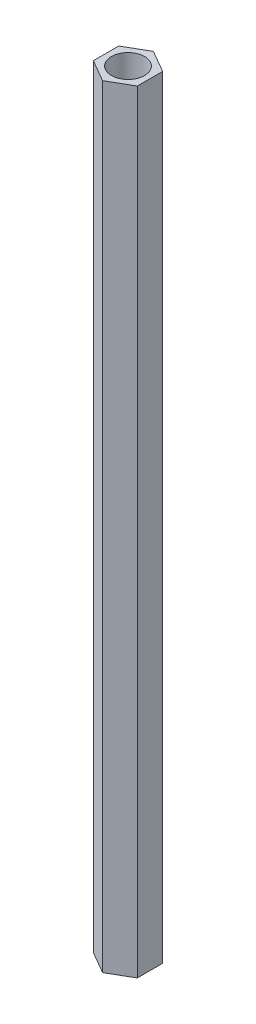
ISO-10303-21;
HEADER;
FILE_DESCRIPTION(('STEP AP214'),'2;1');
FILE_NAME('part.step','',(''),(''),'','','');
FILE_SCHEMA(('AUTOMOTIVE_DESIGN { 1 0 10303 214 1 1 1 1 }'));
ENDSEC;
DATA;
#1=APPLICATION_CONTEXT('core data for automotive mechanical design processes');
#2=APPLICATION_PROTOCOL_DEFINITION('international standard','automotive_design',2000,#1);
#3=PRODUCT_CONTEXT('',#1,'mechanical');
#4=PRODUCT('Part','Part','',(#3));
#5=PRODUCT_RELATED_PRODUCT_CATEGORY('part','',(#4));
#6=PRODUCT_DEFINITION_FORMATION('','',#4);
#7=PRODUCT_DEFINITION_CONTEXT('part definition',#1,'design');
#8=PRODUCT_DEFINITION('design','',#6,#7);
#9=PRODUCT_DEFINITION_SHAPE('','',#8);
#10=(LENGTH_UNIT() NAMED_UNIT(*) SI_UNIT(.MILLI.,.METRE.));
#11=(NAMED_UNIT(*) PLANE_ANGLE_UNIT() SI_UNIT($,.RADIAN.));
#12=(NAMED_UNIT(*) SI_UNIT($,.STERADIAN.) SOLID_ANGLE_UNIT());
#13=UNCERTAINTY_MEASURE_WITH_UNIT(LENGTH_MEASURE(1.E-05),#10,'distance_accuracy_value','');
#14=(GEOMETRIC_REPRESENTATION_CONTEXT(3) GLOBAL_UNCERTAINTY_ASSIGNED_CONTEXT((#13)) GLOBAL_UNIT_ASSIGNED_CONTEXT((#10,
#11,#12)) REPRESENTATION_CONTEXT('',''));
#15=CARTESIAN_POINT('',(0.,0.,0.));
#16=DIRECTION('',(0.,0.,1.));
#17=DIRECTION('',(1.,0.,0.));
#18=AXIS2_PLACEMENT_3D('',#15,#16,#17);
#19=CARTESIAN_POINT('',(0.,70.,0.));
#20=DIRECTION('',(0.,1.,0.));
#21=DIRECTION('',(0.,0.,1.));
#22=AXIS2_PLACEMENT_3D('',#19,#20,#21);
#23=PLANE('',#22);
#24=DIRECTION('',(-0.866025403784439,0.,-0.5));
#25=VECTOR('',#24,1.);
#26=CARTESIAN_POINT('',(1.99185842870421,70.,-1.15));
#27=LINE('',#26,#25);
#28=CARTESIAN_POINT('',(1.99185842870421,70.,-1.15));
#29=VERTEX_POINT('',#28);
#30=CARTESIAN_POINT('',(0.,70.,-2.3));
#31=VERTEX_POINT('',#30);
#32=EDGE_CURVE('E137',#29,#31,#27,.T.);
#33=ORIENTED_EDGE('',*,*,#32,.T.);
#34=DIRECTION('',(-0.866025403784439,0.,0.5));
#35=VECTOR('',#34,1.);
#36=CARTESIAN_POINT('',(0.,70.,-2.3));
#37=LINE('',#36,#35);
#38=CARTESIAN_POINT('',(-1.99185842870421,70.,-1.15));
#39=VERTEX_POINT('',#38);
#40=EDGE_CURVE('E95',#31,#39,#37,.T.);
#41=ORIENTED_EDGE('',*,*,#40,.T.);
#42=DIRECTION('',(0.,0.,1.));
#43=VECTOR('',#42,1.);
#44=CARTESIAN_POINT('',(-1.99185842870421,70.,-1.15));
#45=LINE('',#44,#43);
#46=CARTESIAN_POINT('',(-1.99185842870421,70.,1.15));
#47=VERTEX_POINT('',#46);
#48=EDGE_CURVE('E108',#39,#47,#45,.T.);
#49=ORIENTED_EDGE('',*,*,#48,.T.);
#50=DIRECTION('',(0.866025403784439,0.,0.5));
#51=VECTOR('',#50,1.);
#52=CARTESIAN_POINT('',(-1.99185842870421,70.,1.15));
#53=LINE('',#52,#51);
#54=CARTESIAN_POINT('',(0.,70.,2.3));
#55=VERTEX_POINT('',#54);
#56=EDGE_CURVE('E102',#47,#55,#53,.T.);
#57=ORIENTED_EDGE('',*,*,#56,.T.);
#58=DIRECTION('',(0.866025403784439,0.,-0.5));
#59=VECTOR('',#58,1.);
#60=CARTESIAN_POINT('',(0.,70.,2.3));
#61=LINE('',#60,#59);
#62=CARTESIAN_POINT('',(1.99185842870421,70.,1.15));
#63=VERTEX_POINT('',#62);
#64=EDGE_CURVE('E106',#55,#63,#61,.T.);
#65=ORIENTED_EDGE('',*,*,#64,.T.);
#66=DIRECTION('',(0.,0.,-1.));
#67=VECTOR('',#66,1.);
#68=CARTESIAN_POINT('',(1.99185842870421,70.,1.15));
#69=LINE('',#68,#67);
#70=EDGE_CURVE('E58',#63,#29,#69,.T.);
#71=ORIENTED_EDGE('',*,*,#70,.T.);
#72=EDGE_LOOP('',(#33,#41,#49,#57,#65,#71));
#73=FACE_BOUND('',#72,.T.);
#74=CARTESIAN_POINT('',(0.,70.,0.));
#75=DIRECTION('',(0.,1.,0.));
#76=DIRECTION('',(0.,0.,1.));
#77=AXIS2_PLACEMENT_3D('',#74,#75,#76);
#78=CIRCLE('',#77,1.5);
#79=CARTESIAN_POINT('',(0.,70.,1.5));
#80=VERTEX_POINT('',#79);
#81=EDGE_CURVE('E130',#80,#80,#78,.T.);
#82=ORIENTED_EDGE('',*,*,#81,.F.);
#83=EDGE_LOOP('',(#82));
#84=FACE_BOUND('',#83,.T.);
#85=ADVANCED_FACE('F41',(#73,#84),#23,.T.);
#86=CARTESIAN_POINT('',(0.,0.,0.));
#87=DIRECTION('',(0.,1.,0.));
#88=DIRECTION('',(0.,0.,1.));
#89=AXIS2_PLACEMENT_3D('',#86,#87,#88);
#90=PLANE('',#89);
#91=DIRECTION('',(-0.866025403784439,0.,-0.5));
#92=VECTOR('',#91,1.);
#93=CARTESIAN_POINT('',(1.99185842870421,0.,-1.15));
#94=LINE('',#93,#92);
#95=CARTESIAN_POINT('',(1.99185842870421,0.,-1.15));
#96=VERTEX_POINT('',#95);
#97=CARTESIAN_POINT('',(0.,0.,-2.3));
#98=VERTEX_POINT('',#97);
#99=EDGE_CURVE('E126',#96,#98,#94,.T.);
#100=ORIENTED_EDGE('',*,*,#99,.F.);
#101=DIRECTION('',(0.,0.,-1.));
#102=VECTOR('',#101,1.);
#103=CARTESIAN_POINT('',(1.99185842870421,0.,1.15));
#104=LINE('',#103,#102);
#105=CARTESIAN_POINT('',(1.99185842870421,0.,1.15));
#106=VERTEX_POINT('',#105);
#107=EDGE_CURVE('E87',#106,#96,#104,.T.);
#108=ORIENTED_EDGE('',*,*,#107,.F.);
#109=DIRECTION('',(0.866025403784439,0.,-0.5));
#110=VECTOR('',#109,1.);
#111=CARTESIAN_POINT('',(0.,0.,2.3));
#112=LINE('',#111,#110);
#113=CARTESIAN_POINT('',(0.,0.,2.3));
#114=VERTEX_POINT('',#113);
#115=EDGE_CURVE('E81',#114,#106,#112,.T.);
#116=ORIENTED_EDGE('',*,*,#115,.F.);
#117=DIRECTION('',(0.866025403784439,0.,0.5));
#118=VECTOR('',#117,1.);
#119=CARTESIAN_POINT('',(-1.99185842870421,0.,1.15));
#120=LINE('',#119,#118);
#121=CARTESIAN_POINT('',(-1.99185842870421,0.,1.15));
#122=VERTEX_POINT('',#121);
#123=EDGE_CURVE('E116',#122,#114,#120,.T.);
#124=ORIENTED_EDGE('',*,*,#123,.F.);
#125=DIRECTION('',(0.,0.,1.));
#126=VECTOR('',#125,1.);
#127=CARTESIAN_POINT('',(-1.99185842870421,0.,-1.15));
#128=LINE('',#127,#126);
#129=CARTESIAN_POINT('',(-1.99185842870421,0.,-1.15));
#130=VERTEX_POINT('',#129);
#131=EDGE_CURVE('E132',#130,#122,#128,.T.);
#132=ORIENTED_EDGE('',*,*,#131,.F.);
#133=DIRECTION('',(-0.866025403784439,0.,0.5));
#134=VECTOR('',#133,1.);
#135=CARTESIAN_POINT('',(0.,0.,-2.3));
#136=LINE('',#135,#134);
#137=EDGE_CURVE('E129',#98,#130,#136,.T.);
#138=ORIENTED_EDGE('',*,*,#137,.F.);
#139=EDGE_LOOP('',(#100,#108,#116,#124,#132,#138));
#140=FACE_BOUND('',#139,.T.);
#141=CARTESIAN_POINT('',(0.,0.,0.));
#142=DIRECTION('',(0.,1.,0.));
#143=DIRECTION('',(0.,0.,1.));
#144=AXIS2_PLACEMENT_3D('',#141,#142,#143);
#145=CIRCLE('',#144,1.5);
#146=CARTESIAN_POINT('',(0.,0.,1.5));
#147=VERTEX_POINT('',#146);
#148=EDGE_CURVE('E230',#147,#147,#145,.T.);
#149=ORIENTED_EDGE('',*,*,#148,.T.);
#150=EDGE_LOOP('',(#149));
#151=FACE_BOUND('',#150,.T.);
#152=ADVANCED_FACE('F146',(#140,#151),#90,.F.);
#153=CARTESIAN_POINT('',(1.99185842870421,70.,-1.15));
#154=DIRECTION('',(-0.5,0.,0.866025403784439));
#155=DIRECTION('',(0.866025403784439,0.,0.5));
#156=AXIS2_PLACEMENT_3D('',#153,#154,#155);
#157=PLANE('',#156);
#158=ORIENTED_EDGE('',*,*,#99,.T.);
#159=DIRECTION('',(0.,-1.,0.));
#160=VECTOR('',#159,1.);
#161=CARTESIAN_POINT('',(0.,70.,-2.3));
#162=LINE('',#161,#160);
#163=EDGE_CURVE('E11',#31,#98,#162,.T.);
#164=ORIENTED_EDGE('',*,*,#163,.F.);
#165=ORIENTED_EDGE('',*,*,#32,.F.);
#166=DIRECTION('',(0.,-1.,0.));
#167=VECTOR('',#166,1.);
#168=CARTESIAN_POINT('',(1.99185842870421,70.,-1.15));
#169=LINE('',#168,#167);
#170=EDGE_CURVE('E122',#29,#96,#169,.T.);
#171=ORIENTED_EDGE('',*,*,#170,.T.);
#172=EDGE_LOOP('',(#158,#164,#165,#171));
#173=FACE_BOUND('',#172,.T.);
#174=ADVANCED_FACE('F43',(#173),#157,.F.);
#175=CARTESIAN_POINT('',(0.,70.,-2.3));
#176=DIRECTION('',(0.5,0.,0.866025403784439));
#177=DIRECTION('',(0.866025403784439,0.,-0.5));
#178=AXIS2_PLACEMENT_3D('',#175,#176,#177);
#179=PLANE('',#178);
#180=ORIENTED_EDGE('',*,*,#137,.T.);
#181=DIRECTION('',(0.,-1.,0.));
#182=VECTOR('',#181,1.);
#183=CARTESIAN_POINT('',(-1.99185842870421,70.,-1.15));
#184=LINE('',#183,#182);
#185=EDGE_CURVE('E50',#39,#130,#184,.T.);
#186=ORIENTED_EDGE('',*,*,#185,.F.);
#187=ORIENTED_EDGE('',*,*,#40,.F.);
#188=ORIENTED_EDGE('',*,*,#163,.T.);
#189=EDGE_LOOP('',(#180,#186,#187,#188));
#190=FACE_BOUND('',#189,.T.);
#191=ADVANCED_FACE('F171',(#190),#179,.F.);
#192=CARTESIAN_POINT('',(-1.99185842870421,70.,-1.15));
#193=DIRECTION('',(1.,0.,0.));
#194=DIRECTION('',(0.,0.,-1.));
#195=AXIS2_PLACEMENT_3D('',#192,#193,#194);
#196=PLANE('',#195);
#197=ORIENTED_EDGE('',*,*,#131,.T.);
#198=DIRECTION('',(0.,-1.,0.));
#199=VECTOR('',#198,1.);
#200=CARTESIAN_POINT('',(-1.99185842870421,70.,1.15));
#201=LINE('',#200,#199);
#202=EDGE_CURVE('E117',#47,#122,#201,.T.);
#203=ORIENTED_EDGE('',*,*,#202,.F.);
#204=ORIENTED_EDGE('',*,*,#48,.F.);
#205=ORIENTED_EDGE('',*,*,#185,.T.);
#206=EDGE_LOOP('',(#197,#203,#204,#205));
#207=FACE_BOUND('',#206,.T.);
#208=ADVANCED_FACE('F143',(#207),#196,.F.);
#209=CARTESIAN_POINT('',(-1.99185842870421,70.,1.15));
#210=DIRECTION('',(0.5,0.,-0.866025403784439));
#211=DIRECTION('',(-0.866025403784439,0.,-0.5));
#212=AXIS2_PLACEMENT_3D('',#209,#210,#211);
#213=PLANE('',#212);
#214=ORIENTED_EDGE('',*,*,#123,.T.);
#215=DIRECTION('',(0.,-1.,0.));
#216=VECTOR('',#215,1.);
#217=CARTESIAN_POINT('',(0.,70.,2.3));
#218=LINE('',#217,#216);
#219=EDGE_CURVE('E113',#55,#114,#218,.T.);
#220=ORIENTED_EDGE('',*,*,#219,.F.);
#221=ORIENTED_EDGE('',*,*,#56,.F.);
#222=ORIENTED_EDGE('',*,*,#202,.T.);
#223=EDGE_LOOP('',(#214,#220,#221,#222));
#224=FACE_BOUND('',#223,.T.);
#225=ADVANCED_FACE('F114',(#224),#213,.F.);
#226=CARTESIAN_POINT('',(0.,70.,2.3));
#227=DIRECTION('',(-0.5,0.,-0.866025403784439));
#228=DIRECTION('',(-0.866025403784439,0.,0.5));
#229=AXIS2_PLACEMENT_3D('',#226,#227,#228);
#230=PLANE('',#229);
#231=ORIENTED_EDGE('',*,*,#115,.T.);
#232=DIRECTION('',(0.,-1.,0.));
#233=VECTOR('',#232,1.);
#234=CARTESIAN_POINT('',(1.99185842870421,70.,1.15));
#235=LINE('',#234,#233);
#236=EDGE_CURVE('E118',#63,#106,#235,.T.);
#237=ORIENTED_EDGE('',*,*,#236,.F.);
#238=ORIENTED_EDGE('',*,*,#64,.F.);
#239=ORIENTED_EDGE('',*,*,#219,.T.);
#240=EDGE_LOOP('',(#231,#237,#238,#239));
#241=FACE_BOUND('',#240,.T.);
#242=ADVANCED_FACE('F120',(#241),#230,.F.);
#243=CARTESIAN_POINT('',(1.99185842870421,70.,1.15));
#244=DIRECTION('',(-1.,0.,0.));
#245=DIRECTION('',(0.,0.,1.));
#246=AXIS2_PLACEMENT_3D('',#243,#244,#245);
#247=PLANE('',#246);
#248=ORIENTED_EDGE('',*,*,#107,.T.);
#249=ORIENTED_EDGE('',*,*,#170,.F.);
#250=ORIENTED_EDGE('',*,*,#70,.F.);
#251=ORIENTED_EDGE('',*,*,#236,.T.);
#252=EDGE_LOOP('',(#248,#249,#250,#251));
#253=FACE_BOUND('',#252,.T.);
#254=ADVANCED_FACE('F151',(#253),#247,.F.);
#255=CARTESIAN_POINT('',(0.,70.,0.));
#256=DIRECTION('',(0.,-1.,0.));
#257=DIRECTION('',(0.,0.,-1.));
#258=AXIS2_PLACEMENT_3D('',#255,#256,#257);
#259=CYLINDRICAL_SURFACE('',#258,1.5);
#260=ORIENTED_EDGE('',*,*,#81,.T.);
#261=EDGE_LOOP('',(#260));
#262=FACE_BOUND('',#261,.T.);
#263=ORIENTED_EDGE('',*,*,#148,.F.);
#264=EDGE_LOOP('',(#263));
#265=FACE_BOUND('',#264,.T.);
#266=ADVANCED_FACE('F153',(#262,#265),#259,.F.);
#267=CLOSED_SHELL('',(#85,#152,#174,#191,#208,#225,#242,#254,#266));
#268=MANIFOLD_SOLID_BREP('B2',#267);
#269=ADVANCED_BREP_SHAPE_REPRESENTATION('',(#18,#268),#14);
#270=SHAPE_DEFINITION_REPRESENTATION(#9,#269);
ENDSEC;
END-ISO-10303-21;
